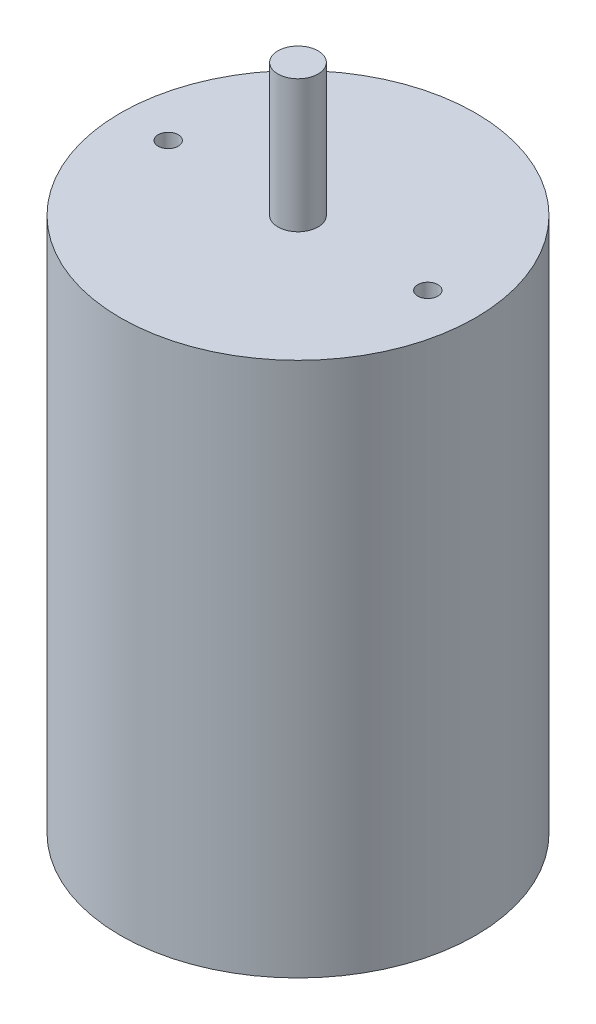
ISO-10303-21;
HEADER;
FILE_DESCRIPTION(('STEP AP214'),'2;1');
FILE_NAME('part.step','',(''),(''),'','','');
FILE_SCHEMA(('AUTOMOTIVE_DESIGN { 1 0 10303 214 1 1 1 1 }'));
ENDSEC;
DATA;
#1=APPLICATION_CONTEXT('core data for automotive mechanical design processes');
#2=APPLICATION_PROTOCOL_DEFINITION('international standard','automotive_design',2000,#1);
#3=PRODUCT_CONTEXT('',#1,'mechanical');
#4=PRODUCT('Part','Part','',(#3));
#5=PRODUCT_RELATED_PRODUCT_CATEGORY('part','',(#4));
#6=PRODUCT_DEFINITION_FORMATION('','',#4);
#7=PRODUCT_DEFINITION_CONTEXT('part definition',#1,'design');
#8=PRODUCT_DEFINITION('design','',#6,#7);
#9=PRODUCT_DEFINITION_SHAPE('','',#8);
#10=(LENGTH_UNIT() NAMED_UNIT(*) SI_UNIT(.MILLI.,.METRE.));
#11=(NAMED_UNIT(*) PLANE_ANGLE_UNIT() SI_UNIT($,.RADIAN.));
#12=(NAMED_UNIT(*) SI_UNIT($,.STERADIAN.) SOLID_ANGLE_UNIT());
#13=UNCERTAINTY_MEASURE_WITH_UNIT(LENGTH_MEASURE(1.E-05),#10,'distance_accuracy_value','');
#14=(GEOMETRIC_REPRESENTATION_CONTEXT(3) GLOBAL_UNCERTAINTY_ASSIGNED_CONTEXT((#13)) GLOBAL_UNIT_ASSIGNED_CONTEXT((#10,
#11,#12)) REPRESENTATION_CONTEXT('',''));
#15=CARTESIAN_POINT('',(0.,0.,0.));
#16=DIRECTION('',(0.,0.,1.));
#17=DIRECTION('',(1.,0.,0.));
#18=AXIS2_PLACEMENT_3D('',#15,#16,#17);
#19=CARTESIAN_POINT('',(0.,66.6,0.));
#20=DIRECTION('',(0.,-1.,0.));
#21=DIRECTION('',(0.,0.,-1.));
#22=AXIS2_PLACEMENT_3D('',#19,#20,#21);
#23=CYLINDRICAL_SURFACE('',#22,22.1);
#24=CARTESIAN_POINT('',(0.,66.6,0.));
#25=DIRECTION('',(0.,1.,0.));
#26=DIRECTION('',(0.,0.,1.));
#27=AXIS2_PLACEMENT_3D('',#24,#25,#26);
#28=CIRCLE('',#27,22.1);
#29=CARTESIAN_POINT('',(0.,66.6,22.1));
#30=VERTEX_POINT('',#29);
#31=EDGE_CURVE('E42',#30,#30,#28,.T.);
#32=ORIENTED_EDGE('',*,*,#31,.F.);
#33=EDGE_LOOP('',(#32));
#34=FACE_BOUND('',#33,.T.);
#35=CARTESIAN_POINT('',(0.,0.,0.));
#36=DIRECTION('',(0.,1.,0.));
#37=DIRECTION('',(0.,0.,1.));
#38=AXIS2_PLACEMENT_3D('',#35,#36,#37);
#39=CIRCLE('',#38,22.1);
#40=CARTESIAN_POINT('',(0.,0.,22.1));
#41=VERTEX_POINT('',#40);
#42=EDGE_CURVE('E46',#41,#41,#39,.T.);
#43=ORIENTED_EDGE('',*,*,#42,.T.);
#44=EDGE_LOOP('',(#43));
#45=FACE_BOUND('',#44,.T.);
#46=ADVANCED_FACE('F36',(#34,#45),#23,.T.);
#47=CARTESIAN_POINT('',(0.,66.6,0.));
#48=DIRECTION('',(0.,1.,0.));
#49=DIRECTION('',(0.,0.,1.));
#50=AXIS2_PLACEMENT_3D('',#47,#48,#49);
#51=PLANE('',#50);
#52=CARTESIAN_POINT('',(-16.165,66.6,0.));
#53=DIRECTION('',(0.,1.,0.));
#54=DIRECTION('',(0.,0.,1.));
#55=AXIS2_PLACEMENT_3D('',#52,#53,#54);
#56=CIRCLE('',#55,1.25);
#57=CARTESIAN_POINT('',(-16.165,66.6,1.25));
#58=VERTEX_POINT('',#57);
#59=EDGE_CURVE('E68',#58,#58,#56,.T.);
#60=ORIENTED_EDGE('',*,*,#59,.F.);
#61=EDGE_LOOP('',(#60));
#62=FACE_BOUND('',#61,.T.);
#63=CARTESIAN_POINT('',(16.165,66.6,0.));
#64=DIRECTION('',(0.,1.,0.));
#65=DIRECTION('',(0.,0.,1.));
#66=AXIS2_PLACEMENT_3D('',#63,#64,#65);
#67=CIRCLE('',#66,1.25);
#68=CARTESIAN_POINT('',(16.165,66.6,1.25));
#69=VERTEX_POINT('',#68);
#70=EDGE_CURVE('E62',#69,#69,#67,.T.);
#71=ORIENTED_EDGE('',*,*,#70,.F.);
#72=EDGE_LOOP('',(#71));
#73=FACE_BOUND('',#72,.T.);
#74=CARTESIAN_POINT('',(0.,66.6,0.));
#75=DIRECTION('',(0.,1.,0.));
#76=DIRECTION('',(0.,0.,1.));
#77=AXIS2_PLACEMENT_3D('',#74,#75,#76);
#78=CIRCLE('',#77,2.5);
#79=CARTESIAN_POINT('',(0.,66.6,2.5));
#80=VERTEX_POINT('',#79);
#81=EDGE_CURVE('E53',#80,#80,#78,.T.);
#82=ORIENTED_EDGE('',*,*,#81,.F.);
#83=EDGE_LOOP('',(#82));
#84=FACE_BOUND('',#83,.T.);
#85=ORIENTED_EDGE('',*,*,#31,.T.);
#86=EDGE_LOOP('',(#85));
#87=FACE_BOUND('',#86,.T.);
#88=ADVANCED_FACE('F83',(#62,#73,#84,#87),#51,.T.);
#89=CARTESIAN_POINT('',(0.,0.,0.));
#90=DIRECTION('',(0.,1.,0.));
#91=DIRECTION('',(0.,0.,1.));
#92=AXIS2_PLACEMENT_3D('',#89,#90,#91);
#93=PLANE('',#92);
#94=CARTESIAN_POINT('',(0.,0.,0.));
#95=DIRECTION('',(0.,1.,0.));
#96=DIRECTION('',(0.,0.,1.));
#97=AXIS2_PLACEMENT_3D('',#94,#95,#96);
#98=CIRCLE('',#97,2.5);
#99=CARTESIAN_POINT('',(0.,0.,2.5));
#100=VERTEX_POINT('',#99);
#101=EDGE_CURVE('E10',#100,#100,#98,.F.);
#102=ORIENTED_EDGE('',*,*,#101,.F.);
#103=EDGE_LOOP('',(#102));
#104=FACE_BOUND('',#103,.T.);
#105=ORIENTED_EDGE('',*,*,#42,.F.);
#106=EDGE_LOOP('',(#105));
#107=FACE_BOUND('',#106,.T.);
#108=ADVANCED_FACE('F86',(#104,#107),#93,.F.);
#109=CARTESIAN_POINT('',(0.,83.1,0.));
#110=DIRECTION('',(0.,-1.,0.));
#111=DIRECTION('',(0.,0.,-1.));
#112=AXIS2_PLACEMENT_3D('',#109,#110,#111);
#113=CYLINDRICAL_SURFACE('',#112,2.5);
#114=CARTESIAN_POINT('',(0.,83.1,0.));
#115=DIRECTION('',(0.,1.,0.));
#116=DIRECTION('',(0.,0.,1.));
#117=AXIS2_PLACEMENT_3D('',#114,#115,#116);
#118=CIRCLE('',#117,2.5);
#119=CARTESIAN_POINT('',(0.,83.1,2.5));
#120=VERTEX_POINT('',#119);
#121=EDGE_CURVE('E51',#120,#120,#118,.T.);
#122=ORIENTED_EDGE('',*,*,#121,.F.);
#123=EDGE_LOOP('',(#122));
#124=FACE_BOUND('',#123,.T.);
#125=ORIENTED_EDGE('',*,*,#81,.T.);
#126=EDGE_LOOP('',(#125));
#127=FACE_BOUND('',#126,.T.);
#128=ADVANCED_FACE('F92',(#124,#127),#113,.T.);
#129=CARTESIAN_POINT('',(0.,83.1,0.));
#130=DIRECTION('',(0.,1.,0.));
#131=DIRECTION('',(0.,0.,1.));
#132=AXIS2_PLACEMENT_3D('',#129,#130,#131);
#133=PLANE('',#132);
#134=ORIENTED_EDGE('',*,*,#121,.T.);
#135=EDGE_LOOP('',(#134));
#136=FACE_BOUND('',#135,.T.);
#137=ADVANCED_FACE('F94',(#136),#133,.T.);
#138=CARTESIAN_POINT('',(0.,-5.,0.));
#139=DIRECTION('',(0.,1.,0.));
#140=DIRECTION('',(0.,0.,1.));
#141=AXIS2_PLACEMENT_3D('',#138,#139,#140);
#142=CYLINDRICAL_SURFACE('',#141,2.5);
#143=CARTESIAN_POINT('',(0.,-5.,0.));
#144=DIRECTION('',(0.,-1.,0.));
#145=DIRECTION('',(0.,0.,-1.));
#146=AXIS2_PLACEMENT_3D('',#143,#144,#145);
#147=CIRCLE('',#146,2.5);
#148=CARTESIAN_POINT('',(0.,-5.,-2.5));
#149=VERTEX_POINT('',#148);
#150=EDGE_CURVE('E56',#149,#149,#147,.T.);
#151=ORIENTED_EDGE('',*,*,#150,.F.);
#152=EDGE_LOOP('',(#151));
#153=FACE_BOUND('',#152,.T.);
#154=ORIENTED_EDGE('',*,*,#101,.T.);
#155=EDGE_LOOP('',(#154));
#156=FACE_BOUND('',#155,.T.);
#157=ADVANCED_FACE('F101',(#153,#156),#142,.T.);
#158=CARTESIAN_POINT('',(0.,-5.,0.));
#159=DIRECTION('',(0.,-1.,0.));
#160=DIRECTION('',(0.,0.,-1.));
#161=AXIS2_PLACEMENT_3D('',#158,#159,#160);
#162=PLANE('',#161);
#163=ORIENTED_EDGE('',*,*,#150,.T.);
#164=EDGE_LOOP('',(#163));
#165=FACE_BOUND('',#164,.T.);
#166=ADVANCED_FACE('F135',(#165),#162,.T.);
#167=CARTESIAN_POINT('',(16.165,61.6,0.));
#168=DIRECTION('',(0.,1.,0.));
#169=DIRECTION('',(0.,0.,1.));
#170=AXIS2_PLACEMENT_3D('',#167,#168,#169);
#171=CYLINDRICAL_SURFACE('',#170,1.25);
#172=CARTESIAN_POINT('',(16.165,61.6,0.));
#173=DIRECTION('',(0.,1.,0.));
#174=DIRECTION('',(0.,0.,1.));
#175=AXIS2_PLACEMENT_3D('',#172,#173,#174);
#176=CIRCLE('',#175,1.25);
#177=CARTESIAN_POINT('',(16.165,61.6,1.25));
#178=VERTEX_POINT('',#177);
#179=EDGE_CURVE('E65',#178,#178,#176,.T.);
#180=ORIENTED_EDGE('',*,*,#179,.F.);
#181=EDGE_LOOP('',(#180));
#182=FACE_BOUND('',#181,.T.);
#183=ORIENTED_EDGE('',*,*,#70,.T.);
#184=EDGE_LOOP('',(#183));
#185=FACE_BOUND('',#184,.T.);
#186=ADVANCED_FACE('F144',(#182,#185),#171,.F.);
#187=CARTESIAN_POINT('',(16.165,61.6,0.));
#188=DIRECTION('',(0.,1.,0.));
#189=DIRECTION('',(0.,0.,1.));
#190=AXIS2_PLACEMENT_3D('',#187,#188,#189);
#191=PLANE('',#190);
#192=ORIENTED_EDGE('',*,*,#179,.T.);
#193=EDGE_LOOP('',(#192));
#194=FACE_BOUND('',#193,.T.);
#195=ADVANCED_FACE('F79',(#194),#191,.T.);
#196=CARTESIAN_POINT('',(-16.165,61.6,0.));
#197=DIRECTION('',(0.,1.,0.));
#198=DIRECTION('',(0.,0.,1.));
#199=AXIS2_PLACEMENT_3D('',#196,#197,#198);
#200=CYLINDRICAL_SURFACE('',#199,1.25);
#201=CARTESIAN_POINT('',(-16.165,61.6,0.));
#202=DIRECTION('',(0.,1.,0.));
#203=DIRECTION('',(0.,0.,1.));
#204=AXIS2_PLACEMENT_3D('',#201,#202,#203);
#205=CIRCLE('',#204,1.25);
#206=CARTESIAN_POINT('',(-16.165,61.6,1.25));
#207=VERTEX_POINT('',#206);
#208=EDGE_CURVE('E61',#207,#207,#205,.T.);
#209=ORIENTED_EDGE('',*,*,#208,.F.);
#210=EDGE_LOOP('',(#209));
#211=FACE_BOUND('',#210,.T.);
#212=ORIENTED_EDGE('',*,*,#59,.T.);
#213=EDGE_LOOP('',(#212));
#214=FACE_BOUND('',#213,.T.);
#215=ADVANCED_FACE('F76',(#211,#214),#200,.F.);
#216=CARTESIAN_POINT('',(-16.165,61.6,0.));
#217=DIRECTION('',(0.,1.,0.));
#218=DIRECTION('',(0.,0.,1.));
#219=AXIS2_PLACEMENT_3D('',#216,#217,#218);
#220=PLANE('',#219);
#221=ORIENTED_EDGE('',*,*,#208,.T.);
#222=EDGE_LOOP('',(#221));
#223=FACE_BOUND('',#222,.T.);
#224=ADVANCED_FACE('F74',(#223),#220,.T.);
#225=CLOSED_SHELL('',(#46,#88,#108,#128,#137,#157,#166,#186,#195,#215,#224));
#226=MANIFOLD_SOLID_BREP('B2',#225);
#227=ADVANCED_BREP_SHAPE_REPRESENTATION('',(#18,#226),#14);
#228=SHAPE_DEFINITION_REPRESENTATION(#9,#227);
ENDSEC;
END-ISO-10303-21;
